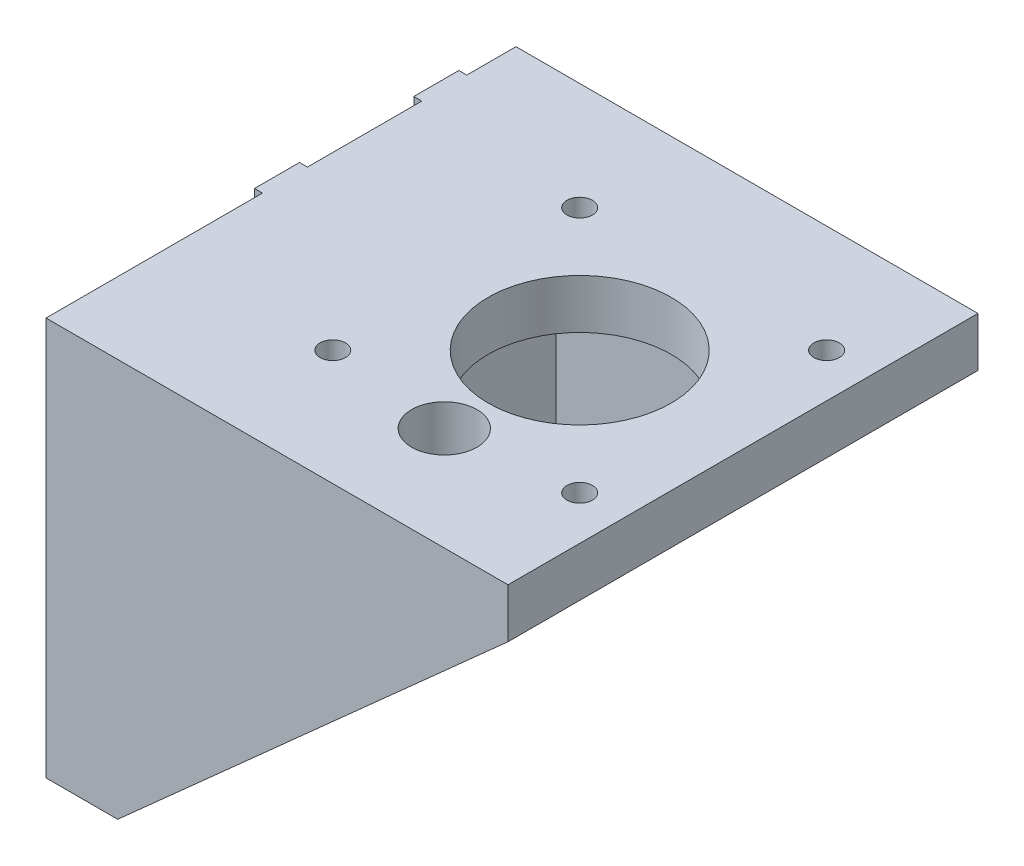
ISO-10303-21;
HEADER;
FILE_DESCRIPTION(('STEP AP214'),'2;1');
FILE_NAME('part.step','',(''),(''),'','','');
FILE_SCHEMA(('AUTOMOTIVE_DESIGN { 1 0 10303 214 1 1 1 1 }'));
ENDSEC;
DATA;
#1=APPLICATION_CONTEXT('core data for automotive mechanical design processes');
#2=APPLICATION_PROTOCOL_DEFINITION('international standard','automotive_design',2000,#1);
#3=PRODUCT_CONTEXT('',#1,'mechanical');
#4=PRODUCT('Part','Part','',(#3));
#5=PRODUCT_RELATED_PRODUCT_CATEGORY('part','',(#4));
#6=PRODUCT_DEFINITION_FORMATION('','',#4);
#7=PRODUCT_DEFINITION_CONTEXT('part definition',#1,'design');
#8=PRODUCT_DEFINITION('design','',#6,#7);
#9=PRODUCT_DEFINITION_SHAPE('','',#8);
#10=(LENGTH_UNIT() NAMED_UNIT(*) SI_UNIT(.MILLI.,.METRE.));
#11=(NAMED_UNIT(*) PLANE_ANGLE_UNIT() SI_UNIT($,.RADIAN.));
#12=(NAMED_UNIT(*) SI_UNIT($,.STERADIAN.) SOLID_ANGLE_UNIT());
#13=UNCERTAINTY_MEASURE_WITH_UNIT(LENGTH_MEASURE(1.E-05),#10,'distance_accuracy_value','');
#14=(GEOMETRIC_REPRESENTATION_CONTEXT(3) GLOBAL_UNCERTAINTY_ASSIGNED_CONTEXT((#13)) GLOBAL_UNIT_ASSIGNED_CONTEXT((#10,
#11,#12)) REPRESENTATION_CONTEXT('',''));
#15=CARTESIAN_POINT('',(0.,0.,0.));
#16=DIRECTION('',(0.,0.,1.));
#17=DIRECTION('',(1.,0.,0.));
#18=AXIS2_PLACEMENT_3D('',#15,#16,#17);
#19=CARTESIAN_POINT('',(0.,11.9,29.));
#20=DIRECTION('',(1.,0.,0.));
#21=DIRECTION('',(0.,0.,-1.));
#22=AXIS2_PLACEMENT_3D('',#19,#20,#21);
#23=CYLINDRICAL_SURFACE('',#22,1.75);
#24=CARTESIAN_POINT('',(-1.,11.9,29.));
#25=DIRECTION('',(-1.,0.,0.));
#26=DIRECTION('',(0.,0.,1.));
#27=AXIS2_PLACEMENT_3D('',#24,#25,#26);
#28=CIRCLE('',#27,1.75);
#29=CARTESIAN_POINT('',(-1.,11.9,30.75));
#30=VERTEX_POINT('',#29);
#31=EDGE_CURVE('E292',#30,#30,#28,.F.);
#32=ORIENTED_EDGE('',*,*,#31,.F.);
#33=EDGE_LOOP('',(#32));
#34=FACE_BOUND('',#33,.T.);
#35=CARTESIAN_POINT('',(5.,11.9,29.));
#36=DIRECTION('',(1.,0.,0.));
#37=DIRECTION('',(0.,0.,-1.));
#38=AXIS2_PLACEMENT_3D('',#35,#36,#37);
#39=CIRCLE('',#38,1.75);
#40=CARTESIAN_POINT('',(5.,11.9,27.25));
#41=VERTEX_POINT('',#40);
#42=EDGE_CURVE('E43',#41,#41,#39,.F.);
#43=ORIENTED_EDGE('',*,*,#42,.F.);
#44=EDGE_LOOP('',(#43));
#45=FACE_BOUND('',#44,.T.);
#46=ADVANCED_FACE('F39',(#34,#45),#23,.F.);
#47=CARTESIAN_POINT('',(0.,31.9,29.));
#48=DIRECTION('',(1.,0.,0.));
#49=DIRECTION('',(0.,0.,-1.));
#50=AXIS2_PLACEMENT_3D('',#47,#48,#49);
#51=CYLINDRICAL_SURFACE('',#50,1.75);
#52=CARTESIAN_POINT('',(-1.,31.9,29.));
#53=DIRECTION('',(-1.,0.,0.));
#54=DIRECTION('',(0.,0.,1.));
#55=AXIS2_PLACEMENT_3D('',#52,#53,#54);
#56=CIRCLE('',#55,1.75);
#57=CARTESIAN_POINT('',(-1.,31.9,30.75));
#58=VERTEX_POINT('',#57);
#59=EDGE_CURVE('E175',#58,#58,#56,.F.);
#60=ORIENTED_EDGE('',*,*,#59,.F.);
#61=EDGE_LOOP('',(#60));
#62=FACE_BOUND('',#61,.T.);
#63=CARTESIAN_POINT('',(5.,31.9,29.));
#64=DIRECTION('',(1.,0.,0.));
#65=DIRECTION('',(0.,0.,-1.));
#66=AXIS2_PLACEMENT_3D('',#63,#64,#65);
#67=CIRCLE('',#66,1.75);
#68=CARTESIAN_POINT('',(5.,31.9,27.25));
#69=VERTEX_POINT('',#68);
#70=EDGE_CURVE('E283',#69,#69,#67,.F.);
#71=ORIENTED_EDGE('',*,*,#70,.F.);
#72=EDGE_LOOP('',(#71));
#73=FACE_BOUND('',#72,.T.);
#74=ADVANCED_FACE('F317',(#62,#73),#51,.F.);
#75=CARTESIAN_POINT('',(0.,31.9,8.99999999999999));
#76=DIRECTION('',(1.,0.,0.));
#77=DIRECTION('',(0.,0.,-1.));
#78=AXIS2_PLACEMENT_3D('',#75,#76,#77);
#79=CYLINDRICAL_SURFACE('',#78,1.75);
#80=CARTESIAN_POINT('',(-1.,31.9,8.99999999999999));
#81=DIRECTION('',(-1.,0.,0.));
#82=DIRECTION('',(0.,0.,1.));
#83=AXIS2_PLACEMENT_3D('',#80,#81,#82);
#84=CIRCLE('',#83,1.75);
#85=CARTESIAN_POINT('',(-1.,31.9,10.75));
#86=VERTEX_POINT('',#85);
#87=EDGE_CURVE('E192',#86,#86,#84,.F.);
#88=ORIENTED_EDGE('',*,*,#87,.F.);
#89=EDGE_LOOP('',(#88));
#90=FACE_BOUND('',#89,.T.);
#91=CARTESIAN_POINT('',(5.,31.9,8.99999999999999));
#92=DIRECTION('',(1.,0.,0.));
#93=DIRECTION('',(0.,0.,-1.));
#94=AXIS2_PLACEMENT_3D('',#91,#92,#93);
#95=CIRCLE('',#94,1.75);
#96=CARTESIAN_POINT('',(5.,31.9,7.24999999999999));
#97=VERTEX_POINT('',#96);
#98=EDGE_CURVE('E280',#97,#97,#95,.F.);
#99=ORIENTED_EDGE('',*,*,#98,.F.);
#100=EDGE_LOOP('',(#99));
#101=FACE_BOUND('',#100,.T.);
#102=ADVANCED_FACE('F323',(#90,#101),#79,.F.);
#103=CARTESIAN_POINT('',(0.,11.9,8.99999999999999));
#104=DIRECTION('',(1.,0.,0.));
#105=DIRECTION('',(0.,0.,-1.));
#106=AXIS2_PLACEMENT_3D('',#103,#104,#105);
#107=CYLINDRICAL_SURFACE('',#106,1.75);
#108=CARTESIAN_POINT('',(-1.,11.9,8.99999999999999));
#109=DIRECTION('',(-1.,0.,0.));
#110=DIRECTION('',(0.,0.,1.));
#111=AXIS2_PLACEMENT_3D('',#108,#109,#110);
#112=CIRCLE('',#111,1.75);
#113=CARTESIAN_POINT('',(-1.,11.9,10.75));
#114=VERTEX_POINT('',#113);
#115=EDGE_CURVE('E189',#114,#114,#112,.F.);
#116=ORIENTED_EDGE('',*,*,#115,.F.);
#117=EDGE_LOOP('',(#116));
#118=FACE_BOUND('',#117,.T.);
#119=CARTESIAN_POINT('',(5.,11.9,8.99999999999999));
#120=DIRECTION('',(1.,0.,0.));
#121=DIRECTION('',(0.,0.,-1.));
#122=AXIS2_PLACEMENT_3D('',#119,#120,#121);
#123=CIRCLE('',#122,1.75);
#124=CARTESIAN_POINT('',(5.,11.9,7.24999999999999));
#125=VERTEX_POINT('',#124);
#126=EDGE_CURVE('E277',#125,#125,#123,.F.);
#127=ORIENTED_EDGE('',*,*,#126,.F.);
#128=EDGE_LOOP('',(#127));
#129=FACE_BOUND('',#128,.T.);
#130=ADVANCED_FACE('F315',(#118,#129),#107,.F.);
#131=CARTESIAN_POINT('',(0.,50.,59.));
#132=DIRECTION('',(1.,0.,0.));
#133=DIRECTION('',(0.,0.,-1.));
#134=AXIS2_PLACEMENT_3D('',#131,#132,#133);
#135=PLANE('',#134);
#136=DIRECTION('',(0.,1.,0.));
#137=VECTOR('',#136,1.);
#138=CARTESIAN_POINT('',(0.,0.,31.825));
#139=LINE('',#138,#137);
#140=CARTESIAN_POINT('',(0.,0.,31.825));
#141=VERTEX_POINT('',#140);
#142=CARTESIAN_POINT('',(0.,50.,31.825));
#143=VERTEX_POINT('',#142);
#144=EDGE_CURVE('E64',#141,#143,#139,.T.);
#145=ORIENTED_EDGE('',*,*,#144,.F.);
#146=DIRECTION('',(0.,0.,-1.));
#147=VECTOR('',#146,1.);
#148=CARTESIAN_POINT('',(0.,0.,59.));
#149=LINE('',#148,#147);
#150=CARTESIAN_POINT('',(0.,0.,59.));
#151=VERTEX_POINT('',#150);
#152=EDGE_CURVE('E179',#151,#141,#149,.T.);
#153=ORIENTED_EDGE('',*,*,#152,.F.);
#154=DIRECTION('',(0.,-1.,0.));
#155=VECTOR('',#154,1.);
#156=CARTESIAN_POINT('',(0.,50.,59.));
#157=LINE('',#156,#155);
#158=CARTESIAN_POINT('',(0.,50.,59.));
#159=VERTEX_POINT('',#158);
#160=EDGE_CURVE('E235',#159,#151,#157,.T.);
#161=ORIENTED_EDGE('',*,*,#160,.F.);
#162=DIRECTION('',(0.,0.,-1.));
#163=VECTOR('',#162,1.);
#164=CARTESIAN_POINT('',(0.,50.,59.));
#165=LINE('',#164,#163);
#166=EDGE_CURVE('E259',#159,#143,#165,.T.);
#167=ORIENTED_EDGE('',*,*,#166,.T.);
#168=EDGE_LOOP('',(#145,#153,#161,#167));
#169=FACE_BOUND('',#168,.T.);
#170=ADVANCED_FACE('F308',(#169),#135,.F.);
#171=DIRECTION('',(0.,-1.,0.));
#172=VECTOR('',#171,1.);
#173=CARTESIAN_POINT('',(0.,0.,26.175));
#174=LINE('',#173,#172);
#175=CARTESIAN_POINT('',(0.,50.,26.175));
#176=VERTEX_POINT('',#175);
#177=CARTESIAN_POINT('',(0.,0.,26.175));
#178=VERTEX_POINT('',#177);
#179=EDGE_CURVE('E290',#176,#178,#174,.T.);
#180=ORIENTED_EDGE('',*,*,#179,.F.);
#181=CARTESIAN_POINT('',(0.,50.,11.825));
#182=VERTEX_POINT('',#181);
#183=EDGE_CURVE('E262',#176,#182,#165,.T.);
#184=ORIENTED_EDGE('',*,*,#183,.T.);
#185=DIRECTION('',(0.,1.,0.));
#186=VECTOR('',#185,1.);
#187=CARTESIAN_POINT('',(0.,0.,11.825));
#188=LINE('',#187,#186);
#189=CARTESIAN_POINT('',(0.,0.,11.825));
#190=VERTEX_POINT('',#189);
#191=EDGE_CURVE('E180',#190,#182,#188,.T.);
#192=ORIENTED_EDGE('',*,*,#191,.F.);
#193=EDGE_CURVE('E56',#178,#190,#149,.T.);
#194=ORIENTED_EDGE('',*,*,#193,.F.);
#195=EDGE_LOOP('',(#180,#184,#192,#194));
#196=FACE_BOUND('',#195,.T.);
#197=ADVANCED_FACE('F306',(#196),#135,.F.);
#198=DIRECTION('',(0.,-1.,0.));
#199=VECTOR('',#198,1.);
#200=CARTESIAN_POINT('',(0.,0.,6.175));
#201=LINE('',#200,#199);
#202=CARTESIAN_POINT('',(0.,50.,6.17499999999999));
#203=VERTEX_POINT('',#202);
#204=CARTESIAN_POINT('',(0.,0.,6.17499999999999));
#205=VERTEX_POINT('',#204);
#206=EDGE_CURVE('E183',#203,#205,#201,.T.);
#207=ORIENTED_EDGE('',*,*,#206,.F.);
#208=CARTESIAN_POINT('',(0.,50.,0.));
#209=VERTEX_POINT('',#208);
#210=EDGE_CURVE('E247',#203,#209,#165,.T.);
#211=ORIENTED_EDGE('',*,*,#210,.T.);
#212=DIRECTION('',(0.,-1.,0.));
#213=VECTOR('',#212,1.);
#214=CARTESIAN_POINT('',(0.,50.,0.));
#215=LINE('',#214,#213);
#216=CARTESIAN_POINT('',(0.,0.,0.));
#217=VERTEX_POINT('',#216);
#218=EDGE_CURVE('E234',#209,#217,#215,.T.);
#219=ORIENTED_EDGE('',*,*,#218,.T.);
#220=EDGE_CURVE('E273',#205,#217,#149,.T.);
#221=ORIENTED_EDGE('',*,*,#220,.F.);
#222=EDGE_LOOP('',(#207,#211,#219,#221));
#223=FACE_BOUND('',#222,.T.);
#224=ADVANCED_FACE('F41',(#223),#135,.F.);
#225=CARTESIAN_POINT('',(8.99999999999999,0.,59.));
#226=DIRECTION('',(-0.666438974816623,0.745559583698961,0.));
#227=DIRECTION('',(-0.745559583698961,-0.666438974816623,0.));
#228=AXIS2_PLACEMENT_3D('',#225,#226,#227);
#229=PLANE('',#228);
#230=DIRECTION('',(0.,0.,-1.));
#231=VECTOR('',#230,1.);
#232=CARTESIAN_POINT('',(8.99999999999999,0.,59.));
#233=LINE('',#232,#231);
#234=CARTESIAN_POINT('',(8.99999999999999,0.,59.));
#235=VERTEX_POINT('',#234);
#236=CARTESIAN_POINT('',(8.99999999999999,0.,54.));
#237=VERTEX_POINT('',#236);
#238=EDGE_CURVE('E270',#235,#237,#233,.T.);
#239=ORIENTED_EDGE('',*,*,#238,.T.);
#240=DIRECTION('',(0.745559583698961,0.666438974816623,0.));
#241=VECTOR('',#240,1.);
#242=CARTESIAN_POINT('',(8.99999999999999,0.,54.));
#243=LINE('',#242,#241);
#244=CARTESIAN_POINT('',(58.,43.8,54.));
#245=VERTEX_POINT('',#244);
#246=EDGE_CURVE('E12',#237,#245,#243,.T.);
#247=ORIENTED_EDGE('',*,*,#246,.T.);
#248=DIRECTION('',(0.,0.,-1.));
#249=VECTOR('',#248,1.);
#250=CARTESIAN_POINT('',(58.,43.8,59.));
#251=LINE('',#250,#249);
#252=CARTESIAN_POINT('',(58.,43.8,59.));
#253=VERTEX_POINT('',#252);
#254=EDGE_CURVE('E266',#253,#245,#251,.T.);
#255=ORIENTED_EDGE('',*,*,#254,.F.);
#256=DIRECTION('',(0.745559583698961,0.666438974816623,0.));
#257=VECTOR('',#256,1.);
#258=CARTESIAN_POINT('',(8.99999999999999,0.,59.));
#259=LINE('',#258,#257);
#260=EDGE_CURVE('E241',#235,#253,#259,.T.);
#261=ORIENTED_EDGE('',*,*,#260,.F.);
#262=EDGE_LOOP('',(#239,#247,#255,#261));
#263=FACE_BOUND('',#262,.T.);
#264=ADVANCED_FACE('F313',(#263),#229,.F.);
#265=CARTESIAN_POINT('',(0.,0.,59.));
#266=DIRECTION('',(0.,1.,0.));
#267=DIRECTION('',(0.,0.,1.));
#268=AXIS2_PLACEMENT_3D('',#265,#266,#267);
#269=PLANE('',#268);
#270=DIRECTION('',(1.,0.,0.));
#271=VECTOR('',#270,1.);
#272=CARTESIAN_POINT('',(0.,0.,0.));
#273=LINE('',#272,#271);
#274=CARTESIAN_POINT('',(8.99999999999999,0.,0.));
#275=VERTEX_POINT('',#274);
#276=EDGE_CURVE('E250',#217,#275,#273,.T.);
#277=ORIENTED_EDGE('',*,*,#276,.T.);
#278=CARTESIAN_POINT('',(8.99999999999997,0.,3.99999999999999));
#279=VERTEX_POINT('',#278);
#280=EDGE_CURVE('E269',#279,#275,#233,.T.);
#281=ORIENTED_EDGE('',*,*,#280,.F.);
#282=DIRECTION('',(0.,0.,1.));
#283=VECTOR('',#282,1.);
#284=CARTESIAN_POINT('',(8.99999999999999,0.,3.99999999999999));
#285=LINE('',#284,#283);
#286=EDGE_CURVE('E226',#279,#237,#285,.T.);
#287=ORIENTED_EDGE('',*,*,#286,.T.);
#288=ORIENTED_EDGE('',*,*,#238,.F.);
#289=DIRECTION('',(1.,0.,0.));
#290=VECTOR('',#289,1.);
#291=CARTESIAN_POINT('',(0.,0.,59.));
#292=LINE('',#291,#290);
#293=EDGE_CURVE('E238',#151,#235,#292,.T.);
#294=ORIENTED_EDGE('',*,*,#293,.F.);
#295=ORIENTED_EDGE('',*,*,#152,.T.);
#296=DIRECTION('',(1.,0.,0.));
#297=VECTOR('',#296,1.);
#298=CARTESIAN_POINT('',(-1.,0.,31.825));
#299=LINE('',#298,#297);
#300=CARTESIAN_POINT('',(-1.,0.,31.825));
#301=VERTEX_POINT('',#300);
#302=EDGE_CURVE('E160',#301,#141,#299,.T.);
#303=ORIENTED_EDGE('',*,*,#302,.F.);
#304=DIRECTION('',(0.,0.,1.));
#305=VECTOR('',#304,1.);
#306=CARTESIAN_POINT('',(-1.,0.,0.));
#307=LINE('',#306,#305);
#308=CARTESIAN_POINT('',(-1.,0.,26.175));
#309=VERTEX_POINT('',#308);
#310=EDGE_CURVE('E166',#309,#301,#307,.T.);
#311=ORIENTED_EDGE('',*,*,#310,.F.);
#312=DIRECTION('',(1.,0.,0.));
#313=VECTOR('',#312,1.);
#314=CARTESIAN_POINT('',(-1.,0.,26.175));
#315=LINE('',#314,#313);
#316=EDGE_CURVE('E297',#309,#178,#315,.T.);
#317=ORIENTED_EDGE('',*,*,#316,.T.);
#318=ORIENTED_EDGE('',*,*,#193,.T.);
#319=DIRECTION('',(1.,0.,0.));
#320=VECTOR('',#319,1.);
#321=CARTESIAN_POINT('',(-1.,0.,11.825));
#322=LINE('',#321,#320);
#323=CARTESIAN_POINT('',(-1.,0.,11.825));
#324=VERTEX_POINT('',#323);
#325=EDGE_CURVE('E215',#324,#190,#322,.T.);
#326=ORIENTED_EDGE('',*,*,#325,.F.);
#327=DIRECTION('',(0.,0.,1.));
#328=VECTOR('',#327,1.);
#329=CARTESIAN_POINT('',(-1.,0.,0.));
#330=LINE('',#329,#328);
#331=CARTESIAN_POINT('',(-1.,0.,6.17499999999999));
#332=VERTEX_POINT('',#331);
#333=EDGE_CURVE('E195',#332,#324,#330,.T.);
#334=ORIENTED_EDGE('',*,*,#333,.F.);
#335=DIRECTION('',(1.,0.,0.));
#336=VECTOR('',#335,1.);
#337=CARTESIAN_POINT('',(-1.,0.,6.17499999999999));
#338=LINE('',#337,#336);
#339=EDGE_CURVE('E203',#332,#205,#338,.T.);
#340=ORIENTED_EDGE('',*,*,#339,.T.);
#341=ORIENTED_EDGE('',*,*,#220,.T.);
#342=EDGE_LOOP('',(#277,#281,#287,#288,#294,#295,#303,#311,#317,#318,#326,#334,#340,#341));
#343=FACE_BOUND('',#342,.T.);
#344=ADVANCED_FACE('F178',(#343),#269,.F.);
#345=CARTESIAN_POINT('',(58.,43.8,4.));
#346=VERTEX_POINT('',#345);
#347=CARTESIAN_POINT('',(58.,43.8,0.));
#348=VERTEX_POINT('',#347);
#349=EDGE_CURVE('E265',#346,#348,#251,.T.);
#350=ORIENTED_EDGE('',*,*,#349,.F.);
#351=DIRECTION('',(-0.745559583698961,-0.666438974816623,0.));
#352=VECTOR('',#351,1.);
#353=CARTESIAN_POINT('',(9.,0.,4.));
#354=LINE('',#353,#352);
#355=EDGE_CURVE('E48',#346,#279,#354,.T.);
#356=ORIENTED_EDGE('',*,*,#355,.T.);
#357=ORIENTED_EDGE('',*,*,#280,.T.);
#358=DIRECTION('',(0.745559583698961,0.666438974816623,0.));
#359=VECTOR('',#358,1.);
#360=CARTESIAN_POINT('',(8.99999999999999,0.,0.));
#361=LINE('',#360,#359);
#362=EDGE_CURVE('E252',#275,#348,#361,.T.);
#363=ORIENTED_EDGE('',*,*,#362,.T.);
#364=EDGE_LOOP('',(#350,#356,#357,#363));
#365=FACE_BOUND('',#364,.T.);
#366=ADVANCED_FACE('F362',(#365),#229,.F.);
#367=CARTESIAN_POINT('',(58.,50.,59.));
#368=DIRECTION('',(-1.,0.,0.));
#369=DIRECTION('',(0.,0.,1.));
#370=AXIS2_PLACEMENT_3D('',#367,#368,#369);
#371=PLANE('',#370);
#372=DIRECTION('',(0.,1.,0.));
#373=VECTOR('',#372,1.);
#374=CARTESIAN_POINT('',(58.,50.,0.));
#375=LINE('',#374,#373);
#376=CARTESIAN_POINT('',(58.,50.,0.));
#377=VERTEX_POINT('',#376);
#378=EDGE_CURVE('E255',#348,#377,#375,.T.);
#379=ORIENTED_EDGE('',*,*,#378,.T.);
#380=DIRECTION('',(0.,0.,-1.));
#381=VECTOR('',#380,1.);
#382=CARTESIAN_POINT('',(58.,50.,59.));
#383=LINE('',#382,#381);
#384=CARTESIAN_POINT('',(58.,50.,59.));
#385=VERTEX_POINT('',#384);
#386=EDGE_CURVE('E261',#385,#377,#383,.T.);
#387=ORIENTED_EDGE('',*,*,#386,.F.);
#388=DIRECTION('',(0.,1.,0.));
#389=VECTOR('',#388,1.);
#390=CARTESIAN_POINT('',(58.,50.,59.));
#391=LINE('',#390,#389);
#392=EDGE_CURVE('E243',#253,#385,#391,.T.);
#393=ORIENTED_EDGE('',*,*,#392,.F.);
#394=ORIENTED_EDGE('',*,*,#254,.T.);
#395=DIRECTION('',(0.,0.,1.));
#396=VECTOR('',#395,1.);
#397=CARTESIAN_POINT('',(58.,43.8,54.));
#398=LINE('',#397,#396);
#399=EDGE_CURVE('E218',#346,#245,#398,.T.);
#400=ORIENTED_EDGE('',*,*,#399,.F.);
#401=ORIENTED_EDGE('',*,*,#349,.T.);
#402=EDGE_LOOP('',(#379,#387,#393,#394,#400,#401));
#403=FACE_BOUND('',#402,.T.);
#404=ADVANCED_FACE('F358',(#403),#371,.F.);
#405=CARTESIAN_POINT('',(0.,50.,59.));
#406=DIRECTION('',(0.,-1.,0.));
#407=DIRECTION('',(0.,0.,-1.));
#408=AXIS2_PLACEMENT_3D('',#405,#406,#407);
#409=PLANE('',#408);
#410=CARTESIAN_POINT('',(21.5,50.,13.5));
#411=DIRECTION('',(0.,1.,0.));
#412=DIRECTION('',(0.,0.,1.));
#413=AXIS2_PLACEMENT_3D('',#410,#411,#412);
#414=CIRCLE('',#413,1.6);
#415=CARTESIAN_POINT('',(21.5,50.,15.1));
#416=VERTEX_POINT('',#415);
#417=EDGE_CURVE('E518',#416,#416,#414,.T.);
#418=ORIENTED_EDGE('',*,*,#417,.F.);
#419=EDGE_LOOP('',(#418));
#420=FACE_BOUND('',#419,.T.);
#421=CARTESIAN_POINT('',(52.5,50.,13.5));
#422=DIRECTION('',(0.,1.,0.));
#423=DIRECTION('',(0.,0.,1.));
#424=AXIS2_PLACEMENT_3D('',#421,#422,#423);
#425=CIRCLE('',#424,1.6);
#426=CARTESIAN_POINT('',(52.5,50.,15.1));
#427=VERTEX_POINT('',#426);
#428=EDGE_CURVE('E526',#427,#427,#425,.T.);
#429=ORIENTED_EDGE('',*,*,#428,.F.);
#430=EDGE_LOOP('',(#429));
#431=FACE_BOUND('',#430,.T.);
#432=CARTESIAN_POINT('',(52.5,50.,44.5));
#433=DIRECTION('',(0.,1.,0.));
#434=DIRECTION('',(0.,0.,1.));
#435=AXIS2_PLACEMENT_3D('',#432,#433,#434);
#436=CIRCLE('',#435,1.6);
#437=CARTESIAN_POINT('',(52.5,50.,46.1));
#438=VERTEX_POINT('',#437);
#439=EDGE_CURVE('E532',#438,#438,#436,.T.);
#440=ORIENTED_EDGE('',*,*,#439,.F.);
#441=EDGE_LOOP('',(#440));
#442=FACE_BOUND('',#441,.T.);
#443=CARTESIAN_POINT('',(21.5,50.,44.5));
#444=DIRECTION('',(0.,1.,0.));
#445=DIRECTION('',(0.,0.,1.));
#446=AXIS2_PLACEMENT_3D('',#443,#444,#445);
#447=CIRCLE('',#446,1.6);
#448=CARTESIAN_POINT('',(21.5,50.,46.1));
#449=VERTEX_POINT('',#448);
#450=EDGE_CURVE('E515',#449,#449,#447,.T.);
#451=ORIENTED_EDGE('',*,*,#450,.F.);
#452=EDGE_LOOP('',(#451));
#453=FACE_BOUND('',#452,.T.);
#454=CARTESIAN_POINT('',(37.,50.,46.));
#455=DIRECTION('',(0.,1.,0.));
#456=DIRECTION('',(0.,0.,1.));
#457=AXIS2_PLACEMENT_3D('',#454,#455,#456);
#458=CIRCLE('',#457,4.1);
#459=CARTESIAN_POINT('',(37.,50.,50.1));
#460=VERTEX_POINT('',#459);
#461=EDGE_CURVE('E512',#460,#460,#458,.T.);
#462=ORIENTED_EDGE('',*,*,#461,.F.);
#463=EDGE_LOOP('',(#462));
#464=FACE_BOUND('',#463,.T.);
#465=CARTESIAN_POINT('',(37.,50.,29.));
#466=DIRECTION('',(0.,1.,0.));
#467=DIRECTION('',(0.,0.,1.));
#468=AXIS2_PLACEMENT_3D('',#465,#466,#467);
#469=CIRCLE('',#468,11.5);
#470=CARTESIAN_POINT('',(37.,50.,40.5));
#471=VERTEX_POINT('',#470);
#472=EDGE_CURVE('E525',#471,#471,#469,.T.);
#473=ORIENTED_EDGE('',*,*,#472,.F.);
#474=EDGE_LOOP('',(#473));
#475=FACE_BOUND('',#474,.T.);
#476=DIRECTION('',(-1.,0.,0.));
#477=VECTOR('',#476,1.);
#478=CARTESIAN_POINT('',(0.,50.,0.));
#479=LINE('',#478,#477);
#480=EDGE_CURVE('E239',#377,#209,#479,.T.);
#481=ORIENTED_EDGE('',*,*,#480,.T.);
#482=ORIENTED_EDGE('',*,*,#210,.F.);
#483=DIRECTION('',(1.,0.,0.));
#484=VECTOR('',#483,1.);
#485=CARTESIAN_POINT('',(-1.,50.,6.17499999999999));
#486=LINE('',#485,#484);
#487=CARTESIAN_POINT('',(-1.,50.,6.17499999999999));
#488=VERTEX_POINT('',#487);
#489=EDGE_CURVE('E209',#488,#203,#486,.T.);
#490=ORIENTED_EDGE('',*,*,#489,.F.);
#491=DIRECTION('',(0.,0.,-1.));
#492=VECTOR('',#491,1.);
#493=CARTESIAN_POINT('',(-1.,50.,0.));
#494=LINE('',#493,#492);
#495=CARTESIAN_POINT('',(-1.,50.,11.825));
#496=VERTEX_POINT('',#495);
#497=EDGE_CURVE('E200',#496,#488,#494,.T.);
#498=ORIENTED_EDGE('',*,*,#497,.F.);
#499=DIRECTION('',(1.,0.,0.));
#500=VECTOR('',#499,1.);
#501=CARTESIAN_POINT('',(-1.,50.,11.825));
#502=LINE('',#501,#500);
#503=EDGE_CURVE('E212',#496,#182,#502,.T.);
#504=ORIENTED_EDGE('',*,*,#503,.T.);
#505=ORIENTED_EDGE('',*,*,#183,.F.);
#506=DIRECTION('',(1.,0.,0.));
#507=VECTOR('',#506,1.);
#508=CARTESIAN_POINT('',(-1.,50.,26.175));
#509=LINE('',#508,#507);
#510=CARTESIAN_POINT('',(-1.,50.,26.175));
#511=VERTEX_POINT('',#510);
#512=EDGE_CURVE('E185',#511,#176,#509,.T.);
#513=ORIENTED_EDGE('',*,*,#512,.F.);
#514=DIRECTION('',(0.,0.,-1.));
#515=VECTOR('',#514,1.);
#516=CARTESIAN_POINT('',(-1.,50.,0.));
#517=LINE('',#516,#515);
#518=CARTESIAN_POINT('',(-1.,50.,31.825));
#519=VERTEX_POINT('',#518);
#520=EDGE_CURVE('E165',#519,#511,#517,.T.);
#521=ORIENTED_EDGE('',*,*,#520,.F.);
#522=DIRECTION('',(1.,0.,0.));
#523=VECTOR('',#522,1.);
#524=CARTESIAN_POINT('',(-1.,50.,31.825));
#525=LINE('',#524,#523);
#526=EDGE_CURVE('E162',#519,#143,#525,.T.);
#527=ORIENTED_EDGE('',*,*,#526,.T.);
#528=ORIENTED_EDGE('',*,*,#166,.F.);
#529=DIRECTION('',(-1.,0.,0.));
#530=VECTOR('',#529,1.);
#531=CARTESIAN_POINT('',(0.,50.,59.));
#532=LINE('',#531,#530);
#533=EDGE_CURVE('E245',#385,#159,#532,.T.);
#534=ORIENTED_EDGE('',*,*,#533,.F.);
#535=ORIENTED_EDGE('',*,*,#386,.T.);
#536=EDGE_LOOP('',(#481,#482,#490,#498,#504,#505,#513,#521,#527,#528,#534,#535));
#537=FACE_BOUND('',#536,.T.);
#538=ADVANCED_FACE('F303',(#420,#431,#442,#453,#464,#475,#537),#409,.F.);
#539=CARTESIAN_POINT('',(0.,0.,59.));
#540=DIRECTION('',(0.,0.,1.));
#541=DIRECTION('',(1.,0.,0.));
#542=AXIS2_PLACEMENT_3D('',#539,#540,#541);
#543=PLANE('',#542);
#544=ORIENTED_EDGE('',*,*,#160,.T.);
#545=ORIENTED_EDGE('',*,*,#293,.T.);
#546=ORIENTED_EDGE('',*,*,#260,.T.);
#547=ORIENTED_EDGE('',*,*,#392,.T.);
#548=ORIENTED_EDGE('',*,*,#533,.T.);
#549=EDGE_LOOP('',(#544,#545,#546,#547,#548));
#550=FACE_BOUND('',#549,.T.);
#551=ADVANCED_FACE('F349',(#550),#543,.T.);
#552=CARTESIAN_POINT('',(0.,0.,0.));
#553=DIRECTION('',(0.,0.,1.));
#554=DIRECTION('',(1.,0.,0.));
#555=AXIS2_PLACEMENT_3D('',#552,#553,#554);
#556=PLANE('',#555);
#557=ORIENTED_EDGE('',*,*,#218,.F.);
#558=ORIENTED_EDGE('',*,*,#480,.F.);
#559=ORIENTED_EDGE('',*,*,#378,.F.);
#560=ORIENTED_EDGE('',*,*,#362,.F.);
#561=ORIENTED_EDGE('',*,*,#276,.F.);
#562=EDGE_LOOP('',(#557,#558,#559,#560,#561));
#563=FACE_BOUND('',#562,.T.);
#564=ADVANCED_FACE('F347',(#563),#556,.F.);
#565=CARTESIAN_POINT('',(-66.4713472106591,0.,54.));
#566=DIRECTION('',(0.,0.,1.));
#567=DIRECTION('',(1.,0.,0.));
#568=AXIS2_PLACEMENT_3D('',#565,#566,#567);
#569=PLANE('',#568);
#570=DIRECTION('',(0.,1.,0.));
#571=VECTOR('',#570,1.);
#572=CARTESIAN_POINT('',(8.99999999999999,0.,54.));
#573=LINE('',#572,#571);
#574=CARTESIAN_POINT('',(8.99999999999999,43.8,54.));
#575=VERTEX_POINT('',#574);
#576=EDGE_CURVE('E224',#237,#575,#573,.T.);
#577=ORIENTED_EDGE('',*,*,#576,.T.);
#578=DIRECTION('',(1.,0.,0.));
#579=VECTOR('',#578,1.);
#580=CARTESIAN_POINT('',(-66.4713472106591,43.8,54.));
#581=LINE('',#580,#579);
#582=EDGE_CURVE('E222',#575,#245,#581,.T.);
#583=ORIENTED_EDGE('',*,*,#582,.T.);
#584=ORIENTED_EDGE('',*,*,#246,.F.);
#585=EDGE_LOOP('',(#577,#583,#584));
#586=FACE_BOUND('',#585,.T.);
#587=ADVANCED_FACE('F343',(#586),#569,.F.);
#588=CARTESIAN_POINT('',(-66.4713472106591,43.8,4.));
#589=DIRECTION('',(0.,0.,-1.));
#590=DIRECTION('',(0.,1.,0.));
#591=AXIS2_PLACEMENT_3D('',#588,#589,#590);
#592=PLANE('',#591);
#593=DIRECTION('',(1.,0.,0.));
#594=VECTOR('',#593,1.);
#595=CARTESIAN_POINT('',(-66.4713472106591,43.8,4.));
#596=LINE('',#595,#594);
#597=CARTESIAN_POINT('',(8.99999999999999,43.8,4.));
#598=VERTEX_POINT('',#597);
#599=EDGE_CURVE('E229',#598,#346,#596,.T.);
#600=ORIENTED_EDGE('',*,*,#599,.F.);
#601=DIRECTION('',(0.,-1.,0.));
#602=VECTOR('',#601,1.);
#603=CARTESIAN_POINT('',(8.99999999999999,43.8,4.));
#604=LINE('',#603,#602);
#605=EDGE_CURVE('E219',#598,#279,#604,.T.);
#606=ORIENTED_EDGE('',*,*,#605,.T.);
#607=ORIENTED_EDGE('',*,*,#355,.F.);
#608=EDGE_LOOP('',(#600,#606,#607));
#609=FACE_BOUND('',#608,.T.);
#610=ADVANCED_FACE('F339',(#609),#592,.F.);
#611=CARTESIAN_POINT('',(-66.4713472106591,43.8,54.));
#612=DIRECTION('',(0.,1.,0.));
#613=DIRECTION('',(0.,0.,1.));
#614=AXIS2_PLACEMENT_3D('',#611,#612,#613);
#615=PLANE('',#614);
#616=CARTESIAN_POINT('',(21.5,43.8,13.5));
#617=DIRECTION('',(0.,1.,0.));
#618=DIRECTION('',(0.,0.,1.));
#619=AXIS2_PLACEMENT_3D('',#616,#617,#618);
#620=CIRCLE('',#619,1.6);
#621=CARTESIAN_POINT('',(21.5,43.8,15.1));
#622=VERTEX_POINT('',#621);
#623=EDGE_CURVE('E521',#622,#622,#620,.F.);
#624=ORIENTED_EDGE('',*,*,#623,.F.);
#625=EDGE_LOOP('',(#624));
#626=FACE_BOUND('',#625,.T.);
#627=CARTESIAN_POINT('',(52.5,43.8,13.5));
#628=DIRECTION('',(0.,1.,0.));
#629=DIRECTION('',(0.,0.,1.));
#630=AXIS2_PLACEMENT_3D('',#627,#628,#629);
#631=CIRCLE('',#630,1.6);
#632=CARTESIAN_POINT('',(52.5,43.8,15.1));
#633=VERTEX_POINT('',#632);
#634=EDGE_CURVE('E522',#633,#633,#631,.F.);
#635=ORIENTED_EDGE('',*,*,#634,.F.);
#636=EDGE_LOOP('',(#635));
#637=FACE_BOUND('',#636,.T.);
#638=CARTESIAN_POINT('',(52.5,43.8,44.5));
#639=DIRECTION('',(0.,1.,0.));
#640=DIRECTION('',(0.,0.,1.));
#641=AXIS2_PLACEMENT_3D('',#638,#639,#640);
#642=CIRCLE('',#641,1.6);
#643=CARTESIAN_POINT('',(52.5,43.8,46.1));
#644=VERTEX_POINT('',#643);
#645=EDGE_CURVE('E529',#644,#644,#642,.F.);
#646=ORIENTED_EDGE('',*,*,#645,.F.);
#647=EDGE_LOOP('',(#646));
#648=FACE_BOUND('',#647,.T.);
#649=CARTESIAN_POINT('',(21.5,43.8,44.5));
#650=DIRECTION('',(0.,1.,0.));
#651=DIRECTION('',(0.,0.,1.));
#652=AXIS2_PLACEMENT_3D('',#649,#650,#651);
#653=CIRCLE('',#652,1.6);
#654=CARTESIAN_POINT('',(21.5,43.8,46.1));
#655=VERTEX_POINT('',#654);
#656=EDGE_CURVE('E535',#655,#655,#653,.F.);
#657=ORIENTED_EDGE('',*,*,#656,.F.);
#658=EDGE_LOOP('',(#657));
#659=FACE_BOUND('',#658,.T.);
#660=CARTESIAN_POINT('',(37.,43.8,46.));
#661=DIRECTION('',(0.,1.,0.));
#662=DIRECTION('',(0.,0.,1.));
#663=AXIS2_PLACEMENT_3D('',#660,#661,#662);
#664=CIRCLE('',#663,4.1);
#665=CARTESIAN_POINT('',(37.,43.8,50.1));
#666=VERTEX_POINT('',#665);
#667=EDGE_CURVE('E509',#666,#666,#664,.F.);
#668=ORIENTED_EDGE('',*,*,#667,.F.);
#669=EDGE_LOOP('',(#668));
#670=FACE_BOUND('',#669,.T.);
#671=CARTESIAN_POINT('',(37.,43.8,29.));
#672=DIRECTION('',(0.,1.,0.));
#673=DIRECTION('',(0.,0.,1.));
#674=AXIS2_PLACEMENT_3D('',#671,#672,#673);
#675=CIRCLE('',#674,11.5);
#676=CARTESIAN_POINT('',(37.,43.8,40.5));
#677=VERTEX_POINT('',#676);
#678=EDGE_CURVE('E544',#677,#677,#675,.F.);
#679=ORIENTED_EDGE('',*,*,#678,.F.);
#680=EDGE_LOOP('',(#679));
#681=FACE_BOUND('',#680,.T.);
#682=DIRECTION('',(0.,0.,-1.));
#683=VECTOR('',#682,1.);
#684=CARTESIAN_POINT('',(8.99999999999999,43.8,54.));
#685=LINE('',#684,#683);
#686=EDGE_CURVE('E221',#575,#598,#685,.T.);
#687=ORIENTED_EDGE('',*,*,#686,.T.);
#688=ORIENTED_EDGE('',*,*,#599,.T.);
#689=ORIENTED_EDGE('',*,*,#399,.T.);
#690=ORIENTED_EDGE('',*,*,#582,.F.);
#691=EDGE_LOOP('',(#687,#688,#689,#690));
#692=FACE_BOUND('',#691,.T.);
#693=ADVANCED_FACE('F335',(#626,#637,#648,#659,#670,#681,#692),#615,.F.);
#694=CARTESIAN_POINT('',(9.,50.,59.));
#695=DIRECTION('',(1.,0.,0.));
#696=DIRECTION('',(0.,0.,-1.));
#697=AXIS2_PLACEMENT_3D('',#694,#695,#696);
#698=PLANE('',#697);
#699=CARTESIAN_POINT('',(9.,31.9,8.99999999999999));
#700=DIRECTION('',(1.,0.,0.));
#701=DIRECTION('',(0.,0.,-1.));
#702=AXIS2_PLACEMENT_3D('',#699,#700,#701);
#703=CIRCLE('',#702,4.35);
#704=CARTESIAN_POINT('',(9.,31.9,4.64999999999999));
#705=VERTEX_POINT('',#704);
#706=EDGE_CURVE('E556',#705,#705,#703,.T.);
#707=ORIENTED_EDGE('',*,*,#706,.F.);
#708=EDGE_LOOP('',(#707));
#709=FACE_BOUND('',#708,.T.);
#710=CARTESIAN_POINT('',(9.,11.9,29.));
#711=DIRECTION('',(1.,0.,0.));
#712=DIRECTION('',(0.,0.,-1.));
#713=AXIS2_PLACEMENT_3D('',#710,#711,#712);
#714=CIRCLE('',#713,4.35);
#715=CARTESIAN_POINT('',(9.,11.9,24.65));
#716=VERTEX_POINT('',#715);
#717=EDGE_CURVE('E550',#716,#716,#714,.T.);
#718=ORIENTED_EDGE('',*,*,#717,.F.);
#719=EDGE_LOOP('',(#718));
#720=FACE_BOUND('',#719,.T.);
#721=CARTESIAN_POINT('',(9.,11.9,8.99999999999999));
#722=DIRECTION('',(1.,0.,0.));
#723=DIRECTION('',(0.,0.,-1.));
#724=AXIS2_PLACEMENT_3D('',#721,#722,#723);
#725=CIRCLE('',#724,4.35);
#726=CARTESIAN_POINT('',(9.,11.9,4.64999999999999));
#727=VERTEX_POINT('',#726);
#728=EDGE_CURVE('E547',#727,#727,#725,.T.);
#729=ORIENTED_EDGE('',*,*,#728,.F.);
#730=EDGE_LOOP('',(#729));
#731=FACE_BOUND('',#730,.T.);
#732=CARTESIAN_POINT('',(9.,31.9,29.));
#733=DIRECTION('',(1.,0.,0.));
#734=DIRECTION('',(0.,0.,-1.));
#735=AXIS2_PLACEMENT_3D('',#732,#733,#734);
#736=CIRCLE('',#735,4.35);
#737=CARTESIAN_POINT('',(9.,31.9,24.65));
#738=VERTEX_POINT('',#737);
#739=EDGE_CURVE('E555',#738,#738,#736,.T.);
#740=ORIENTED_EDGE('',*,*,#739,.F.);
#741=EDGE_LOOP('',(#740));
#742=FACE_BOUND('',#741,.T.);
#743=ORIENTED_EDGE('',*,*,#576,.F.);
#744=ORIENTED_EDGE('',*,*,#286,.F.);
#745=ORIENTED_EDGE('',*,*,#605,.F.);
#746=ORIENTED_EDGE('',*,*,#686,.F.);
#747=EDGE_LOOP('',(#743,#744,#745,#746));
#748=FACE_BOUND('',#747,.T.);
#749=ADVANCED_FACE('F331',(#709,#720,#731,#742,#748),#698,.T.);
#750=CARTESIAN_POINT('',(-1.,0.,11.825));
#751=DIRECTION('',(0.,0.,-1.));
#752=DIRECTION('',(-1.,0.,0.));
#753=AXIS2_PLACEMENT_3D('',#750,#751,#752);
#754=PLANE('',#753);
#755=ORIENTED_EDGE('',*,*,#191,.T.);
#756=ORIENTED_EDGE('',*,*,#503,.F.);
#757=DIRECTION('',(0.,1.,0.));
#758=VECTOR('',#757,1.);
#759=CARTESIAN_POINT('',(-1.,0.,11.825));
#760=LINE('',#759,#758);
#761=EDGE_CURVE('E198',#324,#496,#760,.T.);
#762=ORIENTED_EDGE('',*,*,#761,.F.);
#763=ORIENTED_EDGE('',*,*,#325,.T.);
#764=EDGE_LOOP('',(#755,#756,#762,#763));
#765=FACE_BOUND('',#764,.T.);
#766=ADVANCED_FACE('F334',(#765),#754,.F.);
#767=CARTESIAN_POINT('',(-1.,0.,6.175));
#768=DIRECTION('',(0.,0.,1.));
#769=DIRECTION('',(0.,-1.,0.));
#770=AXIS2_PLACEMENT_3D('',#767,#768,#769);
#771=PLANE('',#770);
#772=ORIENTED_EDGE('',*,*,#206,.T.);
#773=ORIENTED_EDGE('',*,*,#339,.F.);
#774=DIRECTION('',(0.,-1.,0.));
#775=VECTOR('',#774,1.);
#776=CARTESIAN_POINT('',(-1.,0.,6.175));
#777=LINE('',#776,#775);
#778=EDGE_CURVE('E202',#488,#332,#777,.T.);
#779=ORIENTED_EDGE('',*,*,#778,.F.);
#780=ORIENTED_EDGE('',*,*,#489,.T.);
#781=EDGE_LOOP('',(#772,#773,#779,#780));
#782=FACE_BOUND('',#781,.T.);
#783=ADVANCED_FACE('F402',(#782),#771,.F.);
#784=CARTESIAN_POINT('',(-1.,0.,0.));
#785=DIRECTION('',(-1.,0.,0.));
#786=DIRECTION('',(0.,0.,1.));
#787=AXIS2_PLACEMENT_3D('',#784,#785,#786);
#788=PLANE('',#787);
#789=ORIENTED_EDGE('',*,*,#115,.T.);
#790=EDGE_LOOP('',(#789));
#791=FACE_BOUND('',#790,.T.);
#792=ORIENTED_EDGE('',*,*,#87,.T.);
#793=EDGE_LOOP('',(#792));
#794=FACE_BOUND('',#793,.T.);
#795=ORIENTED_EDGE('',*,*,#333,.T.);
#796=ORIENTED_EDGE('',*,*,#761,.T.);
#797=ORIENTED_EDGE('',*,*,#497,.T.);
#798=ORIENTED_EDGE('',*,*,#778,.T.);
#799=EDGE_LOOP('',(#795,#796,#797,#798));
#800=FACE_BOUND('',#799,.T.);
#801=ADVANCED_FACE('F406',(#791,#794,#800),#788,.T.);
#802=CARTESIAN_POINT('',(-1.,0.,31.825));
#803=DIRECTION('',(0.,0.,-1.));
#804=DIRECTION('',(-1.,0.,0.));
#805=AXIS2_PLACEMENT_3D('',#802,#803,#804);
#806=PLANE('',#805);
#807=ORIENTED_EDGE('',*,*,#144,.T.);
#808=ORIENTED_EDGE('',*,*,#526,.F.);
#809=DIRECTION('',(0.,1.,0.));
#810=VECTOR('',#809,1.);
#811=CARTESIAN_POINT('',(-1.,0.,31.825));
#812=LINE('',#811,#810);
#813=EDGE_CURVE('E156',#301,#519,#812,.T.);
#814=ORIENTED_EDGE('',*,*,#813,.F.);
#815=ORIENTED_EDGE('',*,*,#302,.T.);
#816=EDGE_LOOP('',(#807,#808,#814,#815));
#817=FACE_BOUND('',#816,.T.);
#818=ADVANCED_FACE('F158',(#817),#806,.F.);
#819=CARTESIAN_POINT('',(-1.,0.,26.175));
#820=DIRECTION('',(0.,0.,1.));
#821=DIRECTION('',(0.,-1.,0.));
#822=AXIS2_PLACEMENT_3D('',#819,#820,#821);
#823=PLANE('',#822);
#824=ORIENTED_EDGE('',*,*,#179,.T.);
#825=ORIENTED_EDGE('',*,*,#316,.F.);
#826=DIRECTION('',(0.,-1.,0.));
#827=VECTOR('',#826,1.);
#828=CARTESIAN_POINT('',(-1.,0.,26.175));
#829=LINE('',#828,#827);
#830=EDGE_CURVE('E171',#511,#309,#829,.T.);
#831=ORIENTED_EDGE('',*,*,#830,.F.);
#832=ORIENTED_EDGE('',*,*,#512,.T.);
#833=EDGE_LOOP('',(#824,#825,#831,#832));
#834=FACE_BOUND('',#833,.T.);
#835=ADVANCED_FACE('F301',(#834),#823,.F.);
#836=CARTESIAN_POINT('',(-1.,0.,0.));
#837=DIRECTION('',(-1.,0.,0.));
#838=DIRECTION('',(0.,0.,1.));
#839=AXIS2_PLACEMENT_3D('',#836,#837,#838);
#840=PLANE('',#839);
#841=ORIENTED_EDGE('',*,*,#31,.T.);
#842=EDGE_LOOP('',(#841));
#843=FACE_BOUND('',#842,.T.);
#844=ORIENTED_EDGE('',*,*,#59,.T.);
#845=EDGE_LOOP('',(#844));
#846=FACE_BOUND('',#845,.T.);
#847=ORIENTED_EDGE('',*,*,#310,.T.);
#848=ORIENTED_EDGE('',*,*,#813,.T.);
#849=ORIENTED_EDGE('',*,*,#520,.T.);
#850=ORIENTED_EDGE('',*,*,#830,.T.);
#851=EDGE_LOOP('',(#847,#848,#849,#850));
#852=FACE_BOUND('',#851,.T.);
#853=ADVANCED_FACE('F169',(#843,#846,#852),#840,.T.);
#854=CARTESIAN_POINT('',(5.,11.9,8.99999999999999));
#855=DIRECTION('',(1.,0.,0.));
#856=DIRECTION('',(0.,0.,-1.));
#857=AXIS2_PLACEMENT_3D('',#854,#855,#856);
#858=PLANE('',#857);
#859=CARTESIAN_POINT('',(5.,11.9,8.99999999999999));
#860=DIRECTION('',(1.,0.,0.));
#861=DIRECTION('',(0.,0.,-1.));
#862=AXIS2_PLACEMENT_3D('',#859,#860,#861);
#863=CIRCLE('',#862,4.35);
#864=CARTESIAN_POINT('',(5.,11.9,4.64999999999999));
#865=VERTEX_POINT('',#864);
#866=EDGE_CURVE('E548',#865,#865,#863,.T.);
#867=ORIENTED_EDGE('',*,*,#866,.T.);
#868=EDGE_LOOP('',(#867));
#869=FACE_BOUND('',#868,.T.);
#870=ORIENTED_EDGE('',*,*,#126,.T.);
#871=EDGE_LOOP('',(#870));
#872=FACE_BOUND('',#871,.T.);
#873=ADVANCED_FACE('F439',(#869,#872),#858,.T.);
#874=CARTESIAN_POINT('',(5.,11.9,8.99999999999999));
#875=DIRECTION('',(1.,0.,0.));
#876=DIRECTION('',(0.,0.,-1.));
#877=AXIS2_PLACEMENT_3D('',#874,#875,#876);
#878=CYLINDRICAL_SURFACE('',#877,4.35);
#879=ORIENTED_EDGE('',*,*,#866,.F.);
#880=EDGE_LOOP('',(#879));
#881=FACE_BOUND('',#880,.T.);
#882=ORIENTED_EDGE('',*,*,#728,.T.);
#883=EDGE_LOOP('',(#882));
#884=FACE_BOUND('',#883,.T.);
#885=ADVANCED_FACE('F429',(#881,#884),#878,.F.);
#886=CARTESIAN_POINT('',(5.,31.9,8.99999999999999));
#887=DIRECTION('',(1.,0.,0.));
#888=DIRECTION('',(0.,0.,-1.));
#889=AXIS2_PLACEMENT_3D('',#886,#887,#888);
#890=PLANE('',#889);
#891=CARTESIAN_POINT('',(5.,31.9,8.99999999999999));
#892=DIRECTION('',(1.,0.,0.));
#893=DIRECTION('',(0.,0.,-1.));
#894=AXIS2_PLACEMENT_3D('',#891,#892,#893);
#895=CIRCLE('',#894,4.35);
#896=CARTESIAN_POINT('',(5.,31.9,4.64999999999999));
#897=VERTEX_POINT('',#896);
#898=EDGE_CURVE('E553',#897,#897,#895,.T.);
#899=ORIENTED_EDGE('',*,*,#898,.T.);
#900=EDGE_LOOP('',(#899));
#901=FACE_BOUND('',#900,.T.);
#902=ORIENTED_EDGE('',*,*,#98,.T.);
#903=EDGE_LOOP('',(#902));
#904=FACE_BOUND('',#903,.T.);
#905=ADVANCED_FACE('F426',(#901,#904),#890,.T.);
#906=CARTESIAN_POINT('',(5.,31.9,8.99999999999999));
#907=DIRECTION('',(1.,0.,0.));
#908=DIRECTION('',(0.,0.,-1.));
#909=AXIS2_PLACEMENT_3D('',#906,#907,#908);
#910=CYLINDRICAL_SURFACE('',#909,4.35);
#911=ORIENTED_EDGE('',*,*,#898,.F.);
#912=EDGE_LOOP('',(#911));
#913=FACE_BOUND('',#912,.T.);
#914=ORIENTED_EDGE('',*,*,#706,.T.);
#915=EDGE_LOOP('',(#914));
#916=FACE_BOUND('',#915,.T.);
#917=ADVANCED_FACE('F428',(#913,#916),#910,.F.);
#918=CARTESIAN_POINT('',(5.,31.9,29.));
#919=DIRECTION('',(1.,0.,0.));
#920=DIRECTION('',(0.,0.,-1.));
#921=AXIS2_PLACEMENT_3D('',#918,#919,#920);
#922=PLANE('',#921);
#923=CARTESIAN_POINT('',(5.,31.9,29.));
#924=DIRECTION('',(1.,0.,0.));
#925=DIRECTION('',(0.,0.,-1.));
#926=AXIS2_PLACEMENT_3D('',#923,#924,#925);
#927=CIRCLE('',#926,4.35);
#928=CARTESIAN_POINT('',(5.,31.9,24.65));
#929=VERTEX_POINT('',#928);
#930=EDGE_CURVE('E281',#929,#929,#927,.T.);
#931=ORIENTED_EDGE('',*,*,#930,.T.);
#932=EDGE_LOOP('',(#931));
#933=FACE_BOUND('',#932,.T.);
#934=ORIENTED_EDGE('',*,*,#70,.T.);
#935=EDGE_LOOP('',(#934));
#936=FACE_BOUND('',#935,.T.);
#937=ADVANCED_FACE('F436',(#933,#936),#922,.T.);
#938=CARTESIAN_POINT('',(5.,31.9,29.));
#939=DIRECTION('',(1.,0.,0.));
#940=DIRECTION('',(0.,0.,-1.));
#941=AXIS2_PLACEMENT_3D('',#938,#939,#940);
#942=CYLINDRICAL_SURFACE('',#941,4.35);
#943=ORIENTED_EDGE('',*,*,#930,.F.);
#944=EDGE_LOOP('',(#943));
#945=FACE_BOUND('',#944,.T.);
#946=ORIENTED_EDGE('',*,*,#739,.T.);
#947=EDGE_LOOP('',(#946));
#948=FACE_BOUND('',#947,.T.);
#949=ADVANCED_FACE('F449',(#945,#948),#942,.F.);
#950=CARTESIAN_POINT('',(5.,11.9,29.));
#951=DIRECTION('',(1.,0.,0.));
#952=DIRECTION('',(0.,0.,-1.));
#953=AXIS2_PLACEMENT_3D('',#950,#951,#952);
#954=PLANE('',#953);
#955=CARTESIAN_POINT('',(5.,11.9,29.));
#956=DIRECTION('',(1.,0.,0.));
#957=DIRECTION('',(0.,0.,-1.));
#958=AXIS2_PLACEMENT_3D('',#955,#956,#957);
#959=CIRCLE('',#958,4.35);
#960=CARTESIAN_POINT('',(5.,11.9,24.65));
#961=VERTEX_POINT('',#960);
#962=EDGE_CURVE('E559',#961,#961,#959,.T.);
#963=ORIENTED_EDGE('',*,*,#962,.T.);
#964=EDGE_LOOP('',(#963));
#965=FACE_BOUND('',#964,.T.);
#966=ORIENTED_EDGE('',*,*,#42,.T.);
#967=EDGE_LOOP('',(#966));
#968=FACE_BOUND('',#967,.T.);
#969=ADVANCED_FACE('F445',(#965,#968),#954,.T.);
#970=CARTESIAN_POINT('',(5.,11.9,29.));
#971=DIRECTION('',(1.,0.,0.));
#972=DIRECTION('',(0.,0.,-1.));
#973=AXIS2_PLACEMENT_3D('',#970,#971,#972);
#974=CYLINDRICAL_SURFACE('',#973,4.35);
#975=ORIENTED_EDGE('',*,*,#962,.F.);
#976=EDGE_LOOP('',(#975));
#977=FACE_BOUND('',#976,.T.);
#978=ORIENTED_EDGE('',*,*,#717,.T.);
#979=EDGE_LOOP('',(#978));
#980=FACE_BOUND('',#979,.T.);
#981=ADVANCED_FACE('F448',(#977,#980),#974,.F.);
#982=CARTESIAN_POINT('',(37.,11.2730880654188,29.));
#983=DIRECTION('',(0.,1.,0.));
#984=DIRECTION('',(0.,0.,1.));
#985=AXIS2_PLACEMENT_3D('',#982,#983,#984);
#986=CYLINDRICAL_SURFACE('',#985,11.5);
#987=ORIENTED_EDGE('',*,*,#678,.T.);
#988=EDGE_LOOP('',(#987));
#989=FACE_BOUND('',#988,.T.);
#990=ORIENTED_EDGE('',*,*,#472,.T.);
#991=EDGE_LOOP('',(#990));
#992=FACE_BOUND('',#991,.T.);
#993=ADVANCED_FACE('F453',(#989,#992),#986,.F.);
#994=CARTESIAN_POINT('',(37.,11.2730880654188,46.));
#995=DIRECTION('',(0.,1.,0.));
#996=DIRECTION('',(0.,0.,1.));
#997=AXIS2_PLACEMENT_3D('',#994,#995,#996);
#998=CYLINDRICAL_SURFACE('',#997,4.1);
#999=ORIENTED_EDGE('',*,*,#667,.T.);
#1000=EDGE_LOOP('',(#999));
#1001=FACE_BOUND('',#1000,.T.);
#1002=ORIENTED_EDGE('',*,*,#461,.T.);
#1003=EDGE_LOOP('',(#1002));
#1004=FACE_BOUND('',#1003,.T.);
#1005=ADVANCED_FACE('F484',(#1001,#1004),#998,.F.);
#1006=CARTESIAN_POINT('',(21.5,11.2730880654188,44.5));
#1007=DIRECTION('',(0.,1.,0.));
#1008=DIRECTION('',(0.,0.,1.));
#1009=AXIS2_PLACEMENT_3D('',#1006,#1007,#1008);
#1010=CYLINDRICAL_SURFACE('',#1009,1.6);
#1011=ORIENTED_EDGE('',*,*,#656,.T.);
#1012=EDGE_LOOP('',(#1011));
#1013=FACE_BOUND('',#1012,.T.);
#1014=ORIENTED_EDGE('',*,*,#450,.T.);
#1015=EDGE_LOOP('',(#1014));
#1016=FACE_BOUND('',#1015,.T.);
#1017=ADVANCED_FACE('F486',(#1013,#1016),#1010,.F.);
#1018=CARTESIAN_POINT('',(52.5,11.2730880654188,44.5));
#1019=DIRECTION('',(0.,1.,0.));
#1020=DIRECTION('',(0.,0.,1.));
#1021=AXIS2_PLACEMENT_3D('',#1018,#1019,#1020);
#1022=CYLINDRICAL_SURFACE('',#1021,1.6);
#1023=ORIENTED_EDGE('',*,*,#645,.T.);
#1024=EDGE_LOOP('',(#1023));
#1025=FACE_BOUND('',#1024,.T.);
#1026=ORIENTED_EDGE('',*,*,#439,.T.);
#1027=EDGE_LOOP('',(#1026));
#1028=FACE_BOUND('',#1027,.T.);
#1029=ADVANCED_FACE('F489',(#1025,#1028),#1022,.F.);
#1030=CARTESIAN_POINT('',(52.5,11.2730880654188,13.5));
#1031=DIRECTION('',(0.,1.,0.));
#1032=DIRECTION('',(0.,0.,1.));
#1033=AXIS2_PLACEMENT_3D('',#1030,#1031,#1032);
#1034=CYLINDRICAL_SURFACE('',#1033,1.6);
#1035=ORIENTED_EDGE('',*,*,#634,.T.);
#1036=EDGE_LOOP('',(#1035));
#1037=FACE_BOUND('',#1036,.T.);
#1038=ORIENTED_EDGE('',*,*,#428,.T.);
#1039=EDGE_LOOP('',(#1038));
#1040=FACE_BOUND('',#1039,.T.);
#1041=ADVANCED_FACE('F493',(#1037,#1040),#1034,.F.);
#1042=CARTESIAN_POINT('',(21.5,11.2730880654188,13.5));
#1043=DIRECTION('',(0.,1.,0.));
#1044=DIRECTION('',(0.,0.,1.));
#1045=AXIS2_PLACEMENT_3D('',#1042,#1043,#1044);
#1046=CYLINDRICAL_SURFACE('',#1045,1.6);
#1047=ORIENTED_EDGE('',*,*,#623,.T.);
#1048=EDGE_LOOP('',(#1047));
#1049=FACE_BOUND('',#1048,.T.);
#1050=ORIENTED_EDGE('',*,*,#417,.T.);
#1051=EDGE_LOOP('',(#1050));
#1052=FACE_BOUND('',#1051,.T.);
#1053=ADVANCED_FACE('F497',(#1049,#1052),#1046,.F.);
#1054=CLOSED_SHELL('',(#46,#74,#102,#130,#170,#197,#224,#264,#344,#366,#404,#538,#551,#564,#587,
#610,#693,#749,#766,#783,#801,#818,#835,#853,#873,#885,#905,#917,#937,#949,#969,#981,#993,#1005,
#1017,#1029,#1041,#1053));
#1055=MANIFOLD_SOLID_BREP('B2',#1054);
#1056=ADVANCED_BREP_SHAPE_REPRESENTATION('',(#18,#1055),#14);
#1057=SHAPE_DEFINITION_REPRESENTATION(#9,#1056);
ENDSEC;
END-ISO-10303-21;
